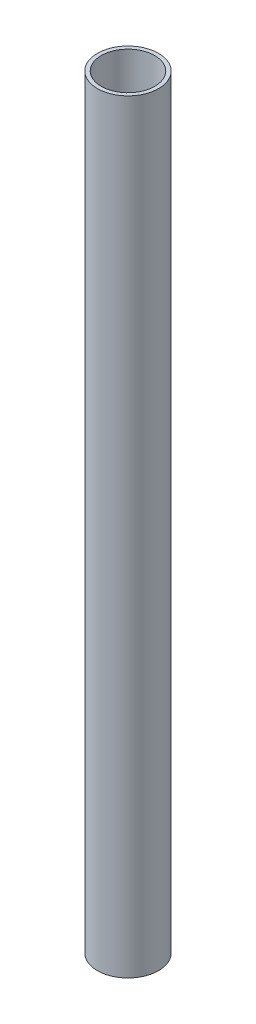
ISO-10303-21;
HEADER;
FILE_DESCRIPTION(('STEP AP214'),'2;1');
FILE_NAME('part.step','',(''),(''),'','','');
FILE_SCHEMA(('AUTOMOTIVE_DESIGN { 1 0 10303 214 1 1 1 1 }'));
ENDSEC;
DATA;
#1=APPLICATION_CONTEXT('core data for automotive mechanical design processes');
#2=APPLICATION_PROTOCOL_DEFINITION('international standard','automotive_design',2000,#1);
#3=PRODUCT_CONTEXT('',#1,'mechanical');
#4=PRODUCT('Part','Part','',(#3));
#5=PRODUCT_RELATED_PRODUCT_CATEGORY('part','',(#4));
#6=PRODUCT_DEFINITION_FORMATION('','',#4);
#7=PRODUCT_DEFINITION_CONTEXT('part definition',#1,'design');
#8=PRODUCT_DEFINITION('design','',#6,#7);
#9=PRODUCT_DEFINITION_SHAPE('','',#8);
#10=(LENGTH_UNIT() NAMED_UNIT(*) SI_UNIT(.MILLI.,.METRE.));
#11=(NAMED_UNIT(*) PLANE_ANGLE_UNIT() SI_UNIT($,.RADIAN.));
#12=(NAMED_UNIT(*) SI_UNIT($,.STERADIAN.) SOLID_ANGLE_UNIT());
#13=UNCERTAINTY_MEASURE_WITH_UNIT(LENGTH_MEASURE(1.E-05),#10,'distance_accuracy_value','');
#14=(GEOMETRIC_REPRESENTATION_CONTEXT(3) GLOBAL_UNCERTAINTY_ASSIGNED_CONTEXT((#13)) GLOBAL_UNIT_ASSIGNED_CONTEXT((#10,
#11,#12)) REPRESENTATION_CONTEXT('',''));
#15=CARTESIAN_POINT('',(0.,0.,0.));
#16=DIRECTION('',(0.,0.,1.));
#17=DIRECTION('',(1.,0.,0.));
#18=AXIS2_PLACEMENT_3D('',#15,#16,#17);
#19=CARTESIAN_POINT('',(0.,200.,0.));
#20=DIRECTION('',(0.,1.,0.));
#21=DIRECTION('',(0.,0.,1.));
#22=AXIS2_PLACEMENT_3D('',#19,#20,#21);
#23=PLANE('',#22);
#24=CARTESIAN_POINT('',(0.,200.,0.));
#25=DIRECTION('',(0.,1.,0.));
#26=DIRECTION('',(0.,0.,1.));
#27=AXIS2_PLACEMENT_3D('',#24,#25,#26);
#28=CIRCLE('',#27,8.);
#29=CARTESIAN_POINT('',(0.,200.,8.));
#30=VERTEX_POINT('',#29);
#31=EDGE_CURVE('E10',#30,#30,#28,.T.);
#32=ORIENTED_EDGE('',*,*,#31,.T.);
#33=EDGE_LOOP('',(#32));
#34=FACE_BOUND('',#33,.T.);
#35=CARTESIAN_POINT('',(0.,200.,0.));
#36=DIRECTION('',(0.,1.,0.));
#37=DIRECTION('',(0.,0.,1.));
#38=AXIS2_PLACEMENT_3D('',#35,#36,#37);
#39=CIRCLE('',#38,7.);
#40=CARTESIAN_POINT('',(0.,200.,7.));
#41=VERTEX_POINT('',#40);
#42=EDGE_CURVE('E44',#41,#41,#39,.T.);
#43=ORIENTED_EDGE('',*,*,#42,.F.);
#44=EDGE_LOOP('',(#43));
#45=FACE_BOUND('',#44,.T.);
#46=ADVANCED_FACE('F33',(#34,#45),#23,.T.);
#47=CARTESIAN_POINT('',(0.,0.,0.));
#48=DIRECTION('',(0.,1.,0.));
#49=DIRECTION('',(0.,0.,1.));
#50=AXIS2_PLACEMENT_3D('',#47,#48,#49);
#51=PLANE('',#50);
#52=CARTESIAN_POINT('',(0.,0.,0.));
#53=DIRECTION('',(0.,1.,0.));
#54=DIRECTION('',(0.,0.,1.));
#55=AXIS2_PLACEMENT_3D('',#52,#53,#54);
#56=CIRCLE('',#55,8.);
#57=CARTESIAN_POINT('',(0.,0.,8.));
#58=VERTEX_POINT('',#57);
#59=EDGE_CURVE('E37',#58,#58,#56,.T.);
#60=ORIENTED_EDGE('',*,*,#59,.F.);
#61=EDGE_LOOP('',(#60));
#62=FACE_BOUND('',#61,.T.);
#63=CARTESIAN_POINT('',(0.,0.,0.));
#64=DIRECTION('',(0.,1.,0.));
#65=DIRECTION('',(0.,0.,1.));
#66=AXIS2_PLACEMENT_3D('',#63,#64,#65);
#67=CIRCLE('',#66,7.);
#68=CARTESIAN_POINT('',(0.,0.,7.));
#69=VERTEX_POINT('',#68);
#70=EDGE_CURVE('E46',#69,#69,#67,.T.);
#71=ORIENTED_EDGE('',*,*,#70,.T.);
#72=EDGE_LOOP('',(#71));
#73=FACE_BOUND('',#72,.T.);
#74=ADVANCED_FACE('F56',(#62,#73),#51,.F.);
#75=CARTESIAN_POINT('',(0.,200.,0.));
#76=DIRECTION('',(0.,-1.,0.));
#77=DIRECTION('',(0.,0.,-1.));
#78=AXIS2_PLACEMENT_3D('',#75,#76,#77);
#79=CYLINDRICAL_SURFACE('',#78,8.);
#80=ORIENTED_EDGE('',*,*,#31,.F.);
#81=EDGE_LOOP('',(#80));
#82=FACE_BOUND('',#81,.T.);
#83=ORIENTED_EDGE('',*,*,#59,.T.);
#84=EDGE_LOOP('',(#83));
#85=FACE_BOUND('',#84,.T.);
#86=ADVANCED_FACE('F35',(#82,#85),#79,.T.);
#87=CARTESIAN_POINT('',(0.,200.,0.));
#88=DIRECTION('',(0.,-1.,0.));
#89=DIRECTION('',(0.,0.,-1.));
#90=AXIS2_PLACEMENT_3D('',#87,#88,#89);
#91=CYLINDRICAL_SURFACE('',#90,7.);
#92=ORIENTED_EDGE('',*,*,#42,.T.);
#93=EDGE_LOOP('',(#92));
#94=FACE_BOUND('',#93,.T.);
#95=ORIENTED_EDGE('',*,*,#70,.F.);
#96=EDGE_LOOP('',(#95));
#97=FACE_BOUND('',#96,.T.);
#98=ADVANCED_FACE('F52',(#94,#97),#91,.F.);
#99=CLOSED_SHELL('',(#46,#74,#86,#98));
#100=MANIFOLD_SOLID_BREP('B2',#99);
#101=ADVANCED_BREP_SHAPE_REPRESENTATION('',(#18,#100),#14);
#102=SHAPE_DEFINITION_REPRESENTATION(#9,#101);
ENDSEC;
END-ISO-10303-21;
